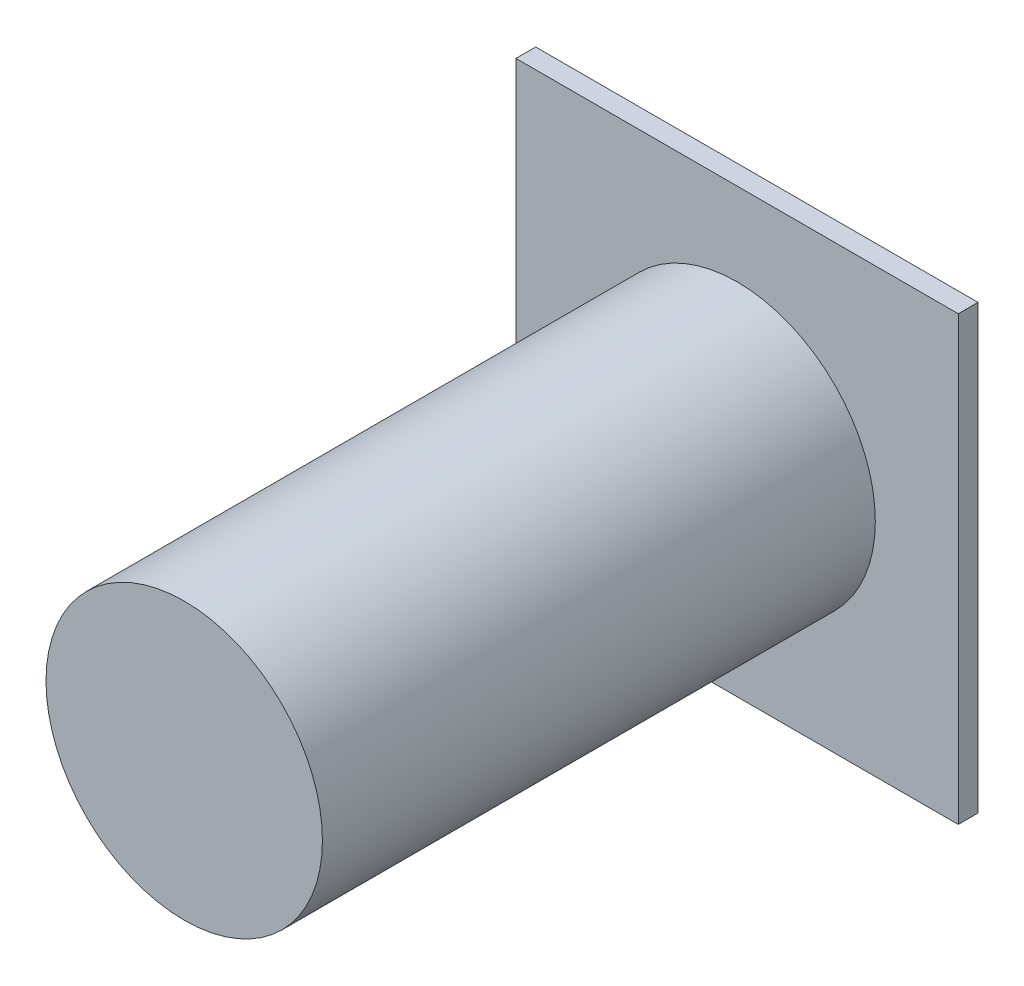
ISO-10303-21;
HEADER;
FILE_DESCRIPTION(('STEP AP214'),'2;1');
FILE_NAME('part.step','',(''),(''),'','','');
FILE_SCHEMA(('AUTOMOTIVE_DESIGN { 1 0 10303 214 1 1 1 1 }'));
ENDSEC;
DATA;
#1=APPLICATION_CONTEXT('core data for automotive mechanical design processes');
#2=APPLICATION_PROTOCOL_DEFINITION('international standard','automotive_design',2000,#1);
#3=PRODUCT_CONTEXT('',#1,'mechanical');
#4=PRODUCT('Part','Part','',(#3));
#5=PRODUCT_RELATED_PRODUCT_CATEGORY('part','',(#4));
#6=PRODUCT_DEFINITION_FORMATION('','',#4);
#7=PRODUCT_DEFINITION_CONTEXT('part definition',#1,'design');
#8=PRODUCT_DEFINITION('design','',#6,#7);
#9=PRODUCT_DEFINITION_SHAPE('','',#8);
#10=(LENGTH_UNIT() NAMED_UNIT(*) SI_UNIT(.MILLI.,.METRE.));
#11=(NAMED_UNIT(*) PLANE_ANGLE_UNIT() SI_UNIT($,.RADIAN.));
#12=(NAMED_UNIT(*) SI_UNIT($,.STERADIAN.) SOLID_ANGLE_UNIT());
#13=UNCERTAINTY_MEASURE_WITH_UNIT(LENGTH_MEASURE(1.E-05),#10,'distance_accuracy_value','');
#14=(GEOMETRIC_REPRESENTATION_CONTEXT(3) GLOBAL_UNCERTAINTY_ASSIGNED_CONTEXT((#13)) GLOBAL_UNIT_ASSIGNED_CONTEXT((#10,
#11,#12)) REPRESENTATION_CONTEXT('',''));
#15=CARTESIAN_POINT('',(0.,0.,0.));
#16=DIRECTION('',(0.,0.,1.));
#17=DIRECTION('',(1.,0.,0.));
#18=AXIS2_PLACEMENT_3D('',#15,#16,#17);
#19=CARTESIAN_POINT('',(-28.,28.,2.5));
#20=DIRECTION('',(1.,0.,0.));
#21=DIRECTION('',(0.,1.,0.));
#22=AXIS2_PLACEMENT_3D('',#19,#20,#21);
#23=PLANE('',#22);
#24=DIRECTION('',(0.,-1.,0.));
#25=VECTOR('',#24,1.);
#26=CARTESIAN_POINT('',(-28.,28.,0.));
#27=LINE('',#26,#25);
#28=CARTESIAN_POINT('',(-28.,28.,0.));
#29=VERTEX_POINT('',#28);
#30=CARTESIAN_POINT('',(-28.,-28.,0.));
#31=VERTEX_POINT('',#30);
#32=EDGE_CURVE('E107',#29,#31,#27,.T.);
#33=ORIENTED_EDGE('',*,*,#32,.T.);
#34=DIRECTION('',(0.,0.,-1.));
#35=VECTOR('',#34,1.);
#36=CARTESIAN_POINT('',(-28.,-28.,2.5));
#37=LINE('',#36,#35);
#38=CARTESIAN_POINT('',(-28.,-28.,2.5));
#39=VERTEX_POINT('',#38);
#40=EDGE_CURVE('E44',#39,#31,#37,.T.);
#41=ORIENTED_EDGE('',*,*,#40,.F.);
#42=DIRECTION('',(0.,-1.,0.));
#43=VECTOR('',#42,1.);
#44=CARTESIAN_POINT('',(-28.,28.,2.5));
#45=LINE('',#44,#43);
#46=CARTESIAN_POINT('',(-28.,28.,2.5));
#47=VERTEX_POINT('',#46);
#48=EDGE_CURVE('E94',#47,#39,#45,.T.);
#49=ORIENTED_EDGE('',*,*,#48,.F.);
#50=DIRECTION('',(0.,0.,-1.));
#51=VECTOR('',#50,1.);
#52=CARTESIAN_POINT('',(-28.,28.,2.5));
#53=LINE('',#52,#51);
#54=EDGE_CURVE('E103',#47,#29,#53,.T.);
#55=ORIENTED_EDGE('',*,*,#54,.T.);
#56=EDGE_LOOP('',(#33,#41,#49,#55));
#57=FACE_BOUND('',#56,.T.);
#58=ADVANCED_FACE('F41',(#57),#23,.F.);
#59=CARTESIAN_POINT('',(-28.,-28.,2.5));
#60=DIRECTION('',(0.,1.,0.));
#61=DIRECTION('',(-1.,0.,0.));
#62=AXIS2_PLACEMENT_3D('',#59,#60,#61);
#63=PLANE('',#62);
#64=DIRECTION('',(1.,0.,0.));
#65=VECTOR('',#64,1.);
#66=CARTESIAN_POINT('',(-28.,-28.,0.));
#67=LINE('',#66,#65);
#68=CARTESIAN_POINT('',(28.,-28.,0.));
#69=VERTEX_POINT('',#68);
#70=EDGE_CURVE('E99',#31,#69,#67,.T.);
#71=ORIENTED_EDGE('',*,*,#70,.T.);
#72=DIRECTION('',(0.,0.,-1.));
#73=VECTOR('',#72,1.);
#74=CARTESIAN_POINT('',(28.,-28.,2.5));
#75=LINE('',#74,#73);
#76=CARTESIAN_POINT('',(28.,-28.,2.5));
#77=VERTEX_POINT('',#76);
#78=EDGE_CURVE('E97',#77,#69,#75,.T.);
#79=ORIENTED_EDGE('',*,*,#78,.F.);
#80=DIRECTION('',(1.,0.,0.));
#81=VECTOR('',#80,1.);
#82=CARTESIAN_POINT('',(-28.,-28.,2.5));
#83=LINE('',#82,#81);
#84=EDGE_CURVE('E89',#39,#77,#83,.T.);
#85=ORIENTED_EDGE('',*,*,#84,.F.);
#86=ORIENTED_EDGE('',*,*,#40,.T.);
#87=EDGE_LOOP('',(#71,#79,#85,#86));
#88=FACE_BOUND('',#87,.T.);
#89=ADVANCED_FACE('F98',(#88),#63,.F.);
#90=CARTESIAN_POINT('',(28.,28.,2.5));
#91=DIRECTION('',(-1.,0.,0.));
#92=DIRECTION('',(0.,-1.,0.));
#93=AXIS2_PLACEMENT_3D('',#90,#91,#92);
#94=PLANE('',#93);
#95=DIRECTION('',(0.,1.,0.));
#96=VECTOR('',#95,1.);
#97=CARTESIAN_POINT('',(28.,28.,0.));
#98=LINE('',#97,#96);
#99=CARTESIAN_POINT('',(28.,28.,0.));
#100=VERTEX_POINT('',#99);
#101=EDGE_CURVE('E75',#69,#100,#98,.T.);
#102=ORIENTED_EDGE('',*,*,#101,.T.);
#103=DIRECTION('',(0.,0.,-1.));
#104=VECTOR('',#103,1.);
#105=CARTESIAN_POINT('',(28.,28.,2.5));
#106=LINE('',#105,#104);
#107=CARTESIAN_POINT('',(28.,28.,2.5));
#108=VERTEX_POINT('',#107);
#109=EDGE_CURVE('E100',#108,#100,#106,.T.);
#110=ORIENTED_EDGE('',*,*,#109,.F.);
#111=DIRECTION('',(0.,1.,0.));
#112=VECTOR('',#111,1.);
#113=CARTESIAN_POINT('',(28.,28.,2.5));
#114=LINE('',#113,#112);
#115=EDGE_CURVE('E92',#77,#108,#114,.T.);
#116=ORIENTED_EDGE('',*,*,#115,.F.);
#117=ORIENTED_EDGE('',*,*,#78,.T.);
#118=EDGE_LOOP('',(#102,#110,#116,#117));
#119=FACE_BOUND('',#118,.T.);
#120=ADVANCED_FACE('F101',(#119),#94,.F.);
#121=CARTESIAN_POINT('',(-28.,28.,2.5));
#122=DIRECTION('',(0.,-1.,0.));
#123=DIRECTION('',(0.,0.,-1.));
#124=AXIS2_PLACEMENT_3D('',#121,#122,#123);
#125=PLANE('',#124);
#126=DIRECTION('',(-1.,0.,0.));
#127=VECTOR('',#126,1.);
#128=CARTESIAN_POINT('',(-28.,28.,0.));
#129=LINE('',#128,#127);
#130=EDGE_CURVE('E81',#100,#29,#129,.T.);
#131=ORIENTED_EDGE('',*,*,#130,.T.);
#132=ORIENTED_EDGE('',*,*,#54,.F.);
#133=DIRECTION('',(-1.,0.,0.));
#134=VECTOR('',#133,1.);
#135=CARTESIAN_POINT('',(-28.,28.,2.5));
#136=LINE('',#135,#134);
#137=EDGE_CURVE('E58',#108,#47,#136,.T.);
#138=ORIENTED_EDGE('',*,*,#137,.F.);
#139=ORIENTED_EDGE('',*,*,#109,.T.);
#140=EDGE_LOOP('',(#131,#132,#138,#139));
#141=FACE_BOUND('',#140,.T.);
#142=ADVANCED_FACE('F115',(#141),#125,.F.);
#143=CARTESIAN_POINT('',(0.,0.,2.5));
#144=DIRECTION('',(0.,0.,1.));
#145=DIRECTION('',(1.,0.,0.));
#146=AXIS2_PLACEMENT_3D('',#143,#144,#145);
#147=PLANE('',#146);
#148=CARTESIAN_POINT('',(0.,0.,2.5));
#149=DIRECTION('',(0.,0.,1.));
#150=DIRECTION('',(1.,0.,0.));
#151=AXIS2_PLACEMENT_3D('',#148,#149,#150);
#152=CIRCLE('',#151,17.5);
#153=CARTESIAN_POINT('',(17.5,0.,2.5));
#154=VERTEX_POINT('',#153);
#155=EDGE_CURVE('E11',#154,#154,#152,.T.);
#156=ORIENTED_EDGE('',*,*,#155,.F.);
#157=EDGE_LOOP('',(#156));
#158=FACE_BOUND('',#157,.T.);
#159=ORIENTED_EDGE('',*,*,#48,.T.);
#160=ORIENTED_EDGE('',*,*,#84,.T.);
#161=ORIENTED_EDGE('',*,*,#115,.T.);
#162=ORIENTED_EDGE('',*,*,#137,.T.);
#163=EDGE_LOOP('',(#159,#160,#161,#162));
#164=FACE_BOUND('',#163,.T.);
#165=ADVANCED_FACE('F90',(#158,#164),#147,.T.);
#166=CARTESIAN_POINT('',(0.,0.,0.));
#167=DIRECTION('',(0.,0.,1.));
#168=DIRECTION('',(1.,0.,0.));
#169=AXIS2_PLACEMENT_3D('',#166,#167,#168);
#170=PLANE('',#169);
#171=ORIENTED_EDGE('',*,*,#32,.F.);
#172=ORIENTED_EDGE('',*,*,#130,.F.);
#173=ORIENTED_EDGE('',*,*,#101,.F.);
#174=ORIENTED_EDGE('',*,*,#70,.F.);
#175=EDGE_LOOP('',(#171,#172,#173,#174));
#176=FACE_BOUND('',#175,.T.);
#177=ADVANCED_FACE('F118',(#176),#170,.F.);
#178=CARTESIAN_POINT('',(0.,0.,72.5));
#179=DIRECTION('',(0.,0.,-1.));
#180=DIRECTION('',(-1.,0.,0.));
#181=AXIS2_PLACEMENT_3D('',#178,#179,#180);
#182=CYLINDRICAL_SURFACE('',#181,17.5);
#183=CARTESIAN_POINT('',(0.,0.,72.5));
#184=DIRECTION('',(0.,0.,1.));
#185=DIRECTION('',(1.,0.,0.));
#186=AXIS2_PLACEMENT_3D('',#183,#184,#185);
#187=CIRCLE('',#186,17.5);
#188=CARTESIAN_POINT('',(17.5,0.,72.5));
#189=VERTEX_POINT('',#188);
#190=EDGE_CURVE('E110',#189,#189,#187,.T.);
#191=ORIENTED_EDGE('',*,*,#190,.F.);
#192=EDGE_LOOP('',(#191));
#193=FACE_BOUND('',#192,.T.);
#194=ORIENTED_EDGE('',*,*,#155,.T.);
#195=EDGE_LOOP('',(#194));
#196=FACE_BOUND('',#195,.T.);
#197=ADVANCED_FACE('F126',(#193,#196),#182,.T.);
#198=CARTESIAN_POINT('',(0.,0.,72.5));
#199=DIRECTION('',(0.,0.,1.));
#200=DIRECTION('',(1.,0.,0.));
#201=AXIS2_PLACEMENT_3D('',#198,#199,#200);
#202=PLANE('',#201);
#203=ORIENTED_EDGE('',*,*,#190,.T.);
#204=EDGE_LOOP('',(#203));
#205=FACE_BOUND('',#204,.T.);
#206=ADVANCED_FACE('F124',(#205),#202,.T.);
#207=CLOSED_SHELL('',(#58,#89,#120,#142,#165,#177,#197,#206));
#208=MANIFOLD_SOLID_BREP('B2',#207);
#209=ADVANCED_BREP_SHAPE_REPRESENTATION('',(#18,#208),#14);
#210=SHAPE_DEFINITION_REPRESENTATION(#9,#209);
ENDSEC;
END-ISO-10303-21;
